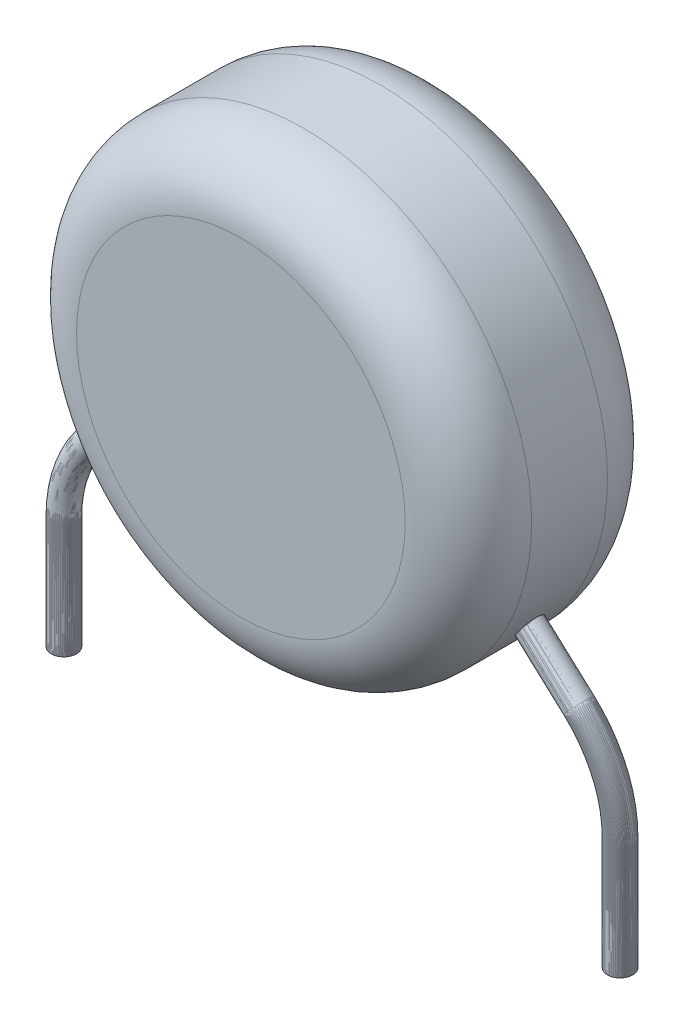
ISO-10303-21;
HEADER;
FILE_DESCRIPTION(('STEP AP214'),'2;1');
FILE_NAME('part.step','',(''),(''),'','','');
FILE_SCHEMA(('AUTOMOTIVE_DESIGN { 1 0 10303 214 1 1 1 1 }'));
ENDSEC;
DATA;
#1=APPLICATION_CONTEXT('core data for automotive mechanical design processes');
#2=APPLICATION_PROTOCOL_DEFINITION('international standard','automotive_design',2000,#1);
#3=PRODUCT_CONTEXT('',#1,'mechanical');
#4=PRODUCT('Part','Part','',(#3));
#5=PRODUCT_RELATED_PRODUCT_CATEGORY('part','',(#4));
#6=PRODUCT_DEFINITION_FORMATION('','',#4);
#7=PRODUCT_DEFINITION_CONTEXT('part definition',#1,'design');
#8=PRODUCT_DEFINITION('design','',#6,#7);
#9=PRODUCT_DEFINITION_SHAPE('','',#8);
#10=(LENGTH_UNIT() NAMED_UNIT(*) SI_UNIT(.MILLI.,.METRE.));
#11=(NAMED_UNIT(*) PLANE_ANGLE_UNIT() SI_UNIT($,.RADIAN.));
#12=(NAMED_UNIT(*) SI_UNIT($,.STERADIAN.) SOLID_ANGLE_UNIT());
#13=UNCERTAINTY_MEASURE_WITH_UNIT(LENGTH_MEASURE(1.E-05),#10,'distance_accuracy_value','');
#14=(GEOMETRIC_REPRESENTATION_CONTEXT(3) GLOBAL_UNCERTAINTY_ASSIGNED_CONTEXT((#13)) GLOBAL_UNIT_ASSIGNED_CONTEXT((#10,
#11,#12)) REPRESENTATION_CONTEXT('',''));
#15=CARTESIAN_POINT('',(0.,0.,0.));
#16=DIRECTION('',(0.,0.,1.));
#17=DIRECTION('',(1.,0.,0.));
#18=AXIS2_PLACEMENT_3D('',#15,#16,#17);
#19=CARTESIAN_POINT('',(11.,0.,0.));
#20=DIRECTION('',(0.,1.,0.));
#21=DIRECTION('',(0.,0.,1.));
#22=AXIS2_PLACEMENT_3D('',#19,#20,#21);
#23=CYLINDRICAL_SURFACE('',#22,0.500000000000001);
#24=CARTESIAN_POINT('',(11.,0.,0.));
#25=DIRECTION('',(0.,1.,0.));
#26=DIRECTION('',(0.,0.,1.));
#27=AXIS2_PLACEMENT_3D('',#24,#25,#26);
#28=CIRCLE('',#27,0.500000000000001);
#29=CARTESIAN_POINT('',(11.,0.,0.500000000000001));
#30=VERTEX_POINT('',#29);
#31=EDGE_CURVE('E49',#30,#30,#28,.T.);
#32=ORIENTED_EDGE('',*,*,#31,.T.);
#33=EDGE_LOOP('',(#32));
#34=FACE_BOUND('',#33,.T.);
#35=CARTESIAN_POINT('',(11.,4.48362223327962,0.));
#36=DIRECTION('',(0.,1.,0.));
#37=DIRECTION('',(0.,0.,1.));
#38=AXIS2_PLACEMENT_3D('',#35,#36,#37);
#39=CIRCLE('',#38,0.500000000000001);
#40=CARTESIAN_POINT('',(11.5,4.48362223327962,0.));
#41=VERTEX_POINT('',#40);
#42=EDGE_CURVE('E11',#41,#41,#39,.T.);
#43=ORIENTED_EDGE('',*,*,#42,.F.);
#44=EDGE_LOOP('',(#43));
#45=FACE_BOUND('',#44,.T.);
#46=ADVANCED_FACE('F42',(#34,#45),#23,.T.);
#47=CARTESIAN_POINT('',(6.,4.48362223327964,0.));
#48=DIRECTION('',(0.,0.,1.));
#49=DIRECTION('',(1.,0.,0.));
#50=AXIS2_PLACEMENT_3D('',#47,#48,#49);
#51=TOROIDAL_SURFACE('',#50,5.,0.500000000000001);
#52=CARTESIAN_POINT('',(9.36771550722865,8.1793619782254,0.));
#53=DIRECTION('',(-0.739147948989153,0.673543101445727,0.));
#54=DIRECTION('',(0.,0.,1.));
#55=AXIS2_PLACEMENT_3D('',#52,#53,#54);
#56=CIRCLE('',#55,0.500000000000001);
#57=CARTESIAN_POINT('',(9.70448705795151,8.54893595271997,0.));
#58=VERTEX_POINT('',#57);
#59=EDGE_CURVE('E55',#58,#58,#56,.T.);
#60=CARTESIAN_POINT('',(6.,4.48362223327964,0.));
#61=DIRECTION('',(0.,0.,1.));
#62=DIRECTION('',(1.,0.,0.));
#63=AXIS2_PLACEMENT_3D('',#60,#61,#62);
#64=CIRCLE('',#63,5.5);
#65=EDGE_CURVE('',#41,#58,#64,.T.);
#66=ORIENTED_EDGE('',*,*,#42,.T.);
#67=ORIENTED_EDGE('',*,*,#59,.F.);
#68=ORIENTED_EDGE('',*,*,#65,.T.);
#69=ORIENTED_EDGE('',*,*,#65,.F.);
#70=EDGE_LOOP('',(#66,#68,#67,#69));
#71=FACE_BOUND('',#70,.T.);
#72=ADVANCED_FACE('F111',(#71),#51,.T.);
#73=CARTESIAN_POINT('',(9.36771550722865,8.1793619782254,0.));
#74=DIRECTION('',(-0.739147948989148,0.673543101445732,0.));
#75=DIRECTION('',(-0.673543101445732,-0.739147948989148,0.));
#76=AXIS2_PLACEMENT_3D('',#73,#74,#75);
#77=CYLINDRICAL_SURFACE('',#76,0.500000000000001);
#78=ORIENTED_EDGE('',*,*,#59,.T.);
#79=EDGE_LOOP('',(#78));
#80=FACE_BOUND('',#79,.T.);
#81=CARTESIAN_POINT('',(3.49835212954528,13.5277759436883,0.));
#82=DIRECTION('',(-0.739147948989153,0.673543101445727,0.));
#83=DIRECTION('',(0.,0.,1.));
#84=AXIS2_PLACEMENT_3D('',#81,#82,#83);
#85=CIRCLE('',#84,0.500000000000001);
#86=CARTESIAN_POINT('',(3.83512368026815,13.8973499181829,0.));
#87=VERTEX_POINT('',#86);
#88=EDGE_CURVE('E60',#87,#87,#85,.T.);
#89=ORIENTED_EDGE('',*,*,#88,.F.);
#90=EDGE_LOOP('',(#89));
#91=FACE_BOUND('',#90,.T.);
#92=ADVANCED_FACE('F105',(#80,#91),#77,.T.);
#93=CARTESIAN_POINT('',(0.13063662231661,9.83203619874261,0.));
#94=DIRECTION('',(0.,0.,1.));
#95=DIRECTION('',(1.,0.,0.));
#96=AXIS2_PLACEMENT_3D('',#93,#94,#95);
#97=TOROIDAL_SURFACE('',#96,5.,0.500000000000001);
#98=CARTESIAN_POINT('',(0.130636622316587,14.8320361987426,0.));
#99=DIRECTION('',(-1.,0.,0.));
#100=DIRECTION('',(0.,0.,1.));
#101=AXIS2_PLACEMENT_3D('',#98,#99,#100);
#102=CIRCLE('',#101,0.500000000000001);
#103=CARTESIAN_POINT('',(0.130636622316585,15.3320361987426,0.));
#104=VERTEX_POINT('',#103);
#105=EDGE_CURVE('E63',#104,#104,#102,.T.);
#106=CARTESIAN_POINT('',(0.13063662231661,9.83203619874261,0.));
#107=DIRECTION('',(0.,0.,1.));
#108=DIRECTION('',(1.,0.,0.));
#109=AXIS2_PLACEMENT_3D('',#106,#107,#108);
#110=CIRCLE('',#109,5.5);
#111=EDGE_CURVE('',#87,#104,#110,.T.);
#112=ORIENTED_EDGE('',*,*,#88,.T.);
#113=ORIENTED_EDGE('',*,*,#105,.F.);
#114=ORIENTED_EDGE('',*,*,#111,.T.);
#115=ORIENTED_EDGE('',*,*,#111,.F.);
#116=EDGE_LOOP('',(#112,#114,#113,#115));
#117=FACE_BOUND('',#116,.T.);
#118=ADVANCED_FACE('F100',(#117),#97,.T.);
#119=CARTESIAN_POINT('',(0.130636622316587,14.8320361987426,0.));
#120=DIRECTION('',(-1.,0.,0.));
#121=DIRECTION('',(0.,0.,1.));
#122=AXIS2_PLACEMENT_3D('',#119,#120,#121);
#123=CYLINDRICAL_SURFACE('',#122,0.500000000000001);
#124=ORIENTED_EDGE('',*,*,#105,.T.);
#125=EDGE_LOOP('',(#124));
#126=FACE_BOUND('',#125,.T.);
#127=CARTESIAN_POINT('',(-0.130636622316592,14.8320361987426,0.));
#128=DIRECTION('',(-1.,0.,0.));
#129=DIRECTION('',(0.,0.,1.));
#130=AXIS2_PLACEMENT_3D('',#127,#128,#129);
#131=CIRCLE('',#130,0.500000000000001);
#132=CARTESIAN_POINT('',(-0.130636622316591,15.3320361987426,0.));
#133=VERTEX_POINT('',#132);
#134=EDGE_CURVE('E66',#133,#133,#131,.T.);
#135=ORIENTED_EDGE('',*,*,#134,.F.);
#136=EDGE_LOOP('',(#135));
#137=FACE_BOUND('',#136,.T.);
#138=ADVANCED_FACE('F94',(#126,#137),#123,.T.);
#139=CARTESIAN_POINT('',(-0.130636622316609,9.83203619874261,0.));
#140=DIRECTION('',(0.,0.,1.));
#141=DIRECTION('',(1.,0.,0.));
#142=AXIS2_PLACEMENT_3D('',#139,#140,#141);
#143=TOROIDAL_SURFACE('',#142,5.,0.500000000000001);
#144=CARTESIAN_POINT('',(-3.49835212954529,13.5277759436883,0.));
#145=DIRECTION('',(-0.739147948989132,-0.67354310144575,0.));
#146=DIRECTION('',(0.,0.,1.));
#147=AXIS2_PLACEMENT_3D('',#144,#145,#146);
#148=CIRCLE('',#147,0.500000000000001);
#149=CARTESIAN_POINT('',(-3.83512368026816,13.8973499181829,0.));
#150=VERTEX_POINT('',#149);
#151=EDGE_CURVE('E69',#150,#150,#148,.T.);
#152=CARTESIAN_POINT('',(-0.130636622316609,9.83203619874261,0.));
#153=DIRECTION('',(0.,0.,1.));
#154=DIRECTION('',(1.,0.,0.));
#155=AXIS2_PLACEMENT_3D('',#152,#153,#154);
#156=CIRCLE('',#155,5.5);
#157=EDGE_CURVE('',#133,#150,#156,.T.);
#158=ORIENTED_EDGE('',*,*,#134,.T.);
#159=ORIENTED_EDGE('',*,*,#151,.F.);
#160=ORIENTED_EDGE('',*,*,#157,.T.);
#161=ORIENTED_EDGE('',*,*,#157,.F.);
#162=EDGE_LOOP('',(#158,#160,#159,#161));
#163=FACE_BOUND('',#162,.T.);
#164=ADVANCED_FACE('F90',(#163),#143,.T.);
#165=CARTESIAN_POINT('',(-3.49835212954529,13.5277759436883,0.));
#166=DIRECTION('',(-0.739147948989148,-0.673543101445732,0.));
#167=DIRECTION('',(0.673543101445732,-0.739147948989148,0.));
#168=AXIS2_PLACEMENT_3D('',#165,#166,#167);
#169=CYLINDRICAL_SURFACE('',#168,0.500000000000001);
#170=ORIENTED_EDGE('',*,*,#151,.T.);
#171=EDGE_LOOP('',(#170));
#172=FACE_BOUND('',#171,.T.);
#173=CARTESIAN_POINT('',(-9.36771550722865,8.17936197822539,0.));
#174=DIRECTION('',(-0.739147948989132,-0.67354310144575,0.));
#175=DIRECTION('',(0.,0.,1.));
#176=AXIS2_PLACEMENT_3D('',#173,#174,#175);
#177=CIRCLE('',#176,0.500000000000001);
#178=CARTESIAN_POINT('',(-9.70448705795151,8.54893595271997,0.));
#179=VERTEX_POINT('',#178);
#180=EDGE_CURVE('E72',#179,#179,#177,.T.);
#181=ORIENTED_EDGE('',*,*,#180,.F.);
#182=EDGE_LOOP('',(#181));
#183=FACE_BOUND('',#182,.T.);
#184=ADVANCED_FACE('F85',(#172,#183),#169,.T.);
#185=CARTESIAN_POINT('',(-6.,4.48362223327964,0.));
#186=DIRECTION('',(0.,0.,1.));
#187=DIRECTION('',(1.,0.,0.));
#188=AXIS2_PLACEMENT_3D('',#185,#186,#187);
#189=TOROIDAL_SURFACE('',#188,5.,0.500000000000001);
#190=CARTESIAN_POINT('',(-11.,4.48362223327962,0.));
#191=DIRECTION('',(0.,-1.,0.));
#192=DIRECTION('',(0.,0.,1.));
#193=AXIS2_PLACEMENT_3D('',#190,#191,#192);
#194=CIRCLE('',#193,0.500000000000001);
#195=CARTESIAN_POINT('',(-11.5,4.48362223327961,0.));
#196=VERTEX_POINT('',#195);
#197=EDGE_CURVE('E74',#196,#196,#194,.T.);
#198=CARTESIAN_POINT('',(-6.,4.48362223327964,0.));
#199=DIRECTION('',(0.,0.,1.));
#200=DIRECTION('',(1.,0.,0.));
#201=AXIS2_PLACEMENT_3D('',#198,#199,#200);
#202=CIRCLE('',#201,5.5);
#203=EDGE_CURVE('',#179,#196,#202,.T.);
#204=ORIENTED_EDGE('',*,*,#180,.T.);
#205=ORIENTED_EDGE('',*,*,#197,.F.);
#206=ORIENTED_EDGE('',*,*,#203,.T.);
#207=ORIENTED_EDGE('',*,*,#203,.F.);
#208=EDGE_LOOP('',(#204,#206,#205,#207));
#209=FACE_BOUND('',#208,.T.);
#210=ADVANCED_FACE('F43',(#209),#189,.T.);
#211=CARTESIAN_POINT('',(-11.,4.48362223327962,0.));
#212=DIRECTION('',(0.,-1.,0.));
#213=DIRECTION('',(0.,0.,-1.));
#214=AXIS2_PLACEMENT_3D('',#211,#212,#213);
#215=CYLINDRICAL_SURFACE('',#214,0.500000000000001);
#216=ORIENTED_EDGE('',*,*,#197,.T.);
#217=EDGE_LOOP('',(#216));
#218=FACE_BOUND('',#217,.T.);
#219=CARTESIAN_POINT('',(-11.,0.,0.));
#220=DIRECTION('',(0.,-1.,0.));
#221=DIRECTION('',(0.,0.,1.));
#222=AXIS2_PLACEMENT_3D('',#219,#220,#221);
#223=CIRCLE('',#222,0.500000000000001);
#224=CARTESIAN_POINT('',(-11.,0.,0.500000000000001));
#225=VERTEX_POINT('',#224);
#226=EDGE_CURVE('E46',#225,#225,#223,.T.);
#227=ORIENTED_EDGE('',*,*,#226,.F.);
#228=EDGE_LOOP('',(#227));
#229=FACE_BOUND('',#228,.T.);
#230=ADVANCED_FACE('F44',(#218,#229),#215,.T.);
#231=OPEN_SHELL('',(#46,#72,#92,#118,#138,#164,#184,#210,#230));
#232=SHELL_BASED_SURFACE_MODEL('B2',(#231));
#233=CARTESIAN_POINT('',(-11.,0.,0.));
#234=DIRECTION('',(0.,1.,0.));
#235=DIRECTION('',(0.,0.,1.));
#236=AXIS2_PLACEMENT_3D('',#233,#234,#235);
#237=CYLINDRICAL_SURFACE('',#236,0.500000000000001);
#238=CARTESIAN_POINT('',(-11.,0.,0.));
#239=DIRECTION('',(0.,1.,0.));
#240=DIRECTION('',(0.,0.,1.));
#241=AXIS2_PLACEMENT_3D('',#238,#239,#240);
#242=CIRCLE('',#241,0.500000000000001);
#243=CARTESIAN_POINT('',(-11.,0.,0.500000000000001));
#244=VERTEX_POINT('',#243);
#245=EDGE_CURVE('E202',#244,#244,#242,.T.);
#246=ORIENTED_EDGE('',*,*,#245,.T.);
#247=EDGE_LOOP('',(#246));
#248=FACE_BOUND('',#247,.T.);
#249=CARTESIAN_POINT('',(-11.,4.48362223327962,0.));
#250=DIRECTION('',(0.,1.,0.));
#251=DIRECTION('',(0.,0.,1.));
#252=AXIS2_PLACEMENT_3D('',#249,#250,#251);
#253=CIRCLE('',#252,0.500000000000001);
#254=CARTESIAN_POINT('',(-11.5,4.48362223327962,0.));
#255=VERTEX_POINT('',#254);
#256=EDGE_CURVE('E41',#255,#255,#253,.T.);
#257=ORIENTED_EDGE('',*,*,#256,.F.);
#258=EDGE_LOOP('',(#257));
#259=FACE_BOUND('',#258,.T.);
#260=ADVANCED_FACE('F195',(#248,#259),#237,.T.);
#261=CARTESIAN_POINT('',(-6.,4.48362223327964,0.));
#262=DIRECTION('',(0.,0.,-1.));
#263=DIRECTION('',(-1.,0.,0.));
#264=AXIS2_PLACEMENT_3D('',#261,#262,#263);
#265=TOROIDAL_SURFACE('',#264,5.,0.500000000000001);
#266=CARTESIAN_POINT('',(-9.36771550722864,8.1793619782254,0.));
#267=DIRECTION('',(0.739147948989154,0.673543101445726,0.));
#268=DIRECTION('',(0.,0.,1.));
#269=AXIS2_PLACEMENT_3D('',#266,#267,#268);
#270=CIRCLE('',#269,0.500000000000001);
#271=CARTESIAN_POINT('',(-9.70448705795151,8.54893595271997,0.));
#272=VERTEX_POINT('',#271);
#273=EDGE_CURVE('E208',#272,#272,#270,.T.);
#274=CARTESIAN_POINT('',(-6.,4.48362223327964,0.));
#275=DIRECTION('',(0.,0.,-1.));
#276=DIRECTION('',(-1.,0.,0.));
#277=AXIS2_PLACEMENT_3D('',#274,#275,#276);
#278=CIRCLE('',#277,5.5);
#279=EDGE_CURVE('',#255,#272,#278,.T.);
#280=ORIENTED_EDGE('',*,*,#256,.T.);
#281=ORIENTED_EDGE('',*,*,#273,.F.);
#282=ORIENTED_EDGE('',*,*,#279,.T.);
#283=ORIENTED_EDGE('',*,*,#279,.F.);
#284=EDGE_LOOP('',(#280,#282,#281,#283));
#285=FACE_BOUND('',#284,.T.);
#286=ADVANCED_FACE('F264',(#285),#265,.T.);
#287=CARTESIAN_POINT('',(-9.36771550722864,8.1793619782254,0.));
#288=DIRECTION('',(0.739147948989148,0.673543101445732,0.));
#289=DIRECTION('',(-0.673543101445732,0.739147948989148,0.));
#290=AXIS2_PLACEMENT_3D('',#287,#288,#289);
#291=CYLINDRICAL_SURFACE('',#290,0.500000000000001);
#292=ORIENTED_EDGE('',*,*,#273,.T.);
#293=EDGE_LOOP('',(#292));
#294=FACE_BOUND('',#293,.T.);
#295=CARTESIAN_POINT('',(-3.49835212954528,13.5277759436883,0.));
#296=DIRECTION('',(0.739147948989154,0.673543101445726,0.));
#297=DIRECTION('',(0.,0.,1.));
#298=AXIS2_PLACEMENT_3D('',#295,#296,#297);
#299=CIRCLE('',#298,0.500000000000001);
#300=CARTESIAN_POINT('',(-3.83512368026815,13.8973499181829,0.));
#301=VERTEX_POINT('',#300);
#302=EDGE_CURVE('E213',#301,#301,#299,.T.);
#303=ORIENTED_EDGE('',*,*,#302,.F.);
#304=EDGE_LOOP('',(#303));
#305=FACE_BOUND('',#304,.T.);
#306=ADVANCED_FACE('F258',(#294,#305),#291,.T.);
#307=CARTESIAN_POINT('',(-0.13063662231661,9.83203619874261,0.));
#308=DIRECTION('',(0.,0.,-1.));
#309=DIRECTION('',(-1.,0.,0.));
#310=AXIS2_PLACEMENT_3D('',#307,#308,#309);
#311=TOROIDAL_SURFACE('',#310,5.,0.500000000000001);
#312=CARTESIAN_POINT('',(-0.130636622316587,14.8320361987426,0.));
#313=DIRECTION('',(1.,0.,0.));
#314=DIRECTION('',(0.,0.,1.));
#315=AXIS2_PLACEMENT_3D('',#312,#313,#314);
#316=CIRCLE('',#315,0.500000000000001);
#317=CARTESIAN_POINT('',(-0.130636622316585,15.3320361987426,0.));
#318=VERTEX_POINT('',#317);
#319=EDGE_CURVE('E216',#318,#318,#316,.T.);
#320=CARTESIAN_POINT('',(-0.13063662231661,9.83203619874261,0.));
#321=DIRECTION('',(0.,0.,-1.));
#322=DIRECTION('',(-1.,0.,0.));
#323=AXIS2_PLACEMENT_3D('',#320,#321,#322);
#324=CIRCLE('',#323,5.5);
#325=EDGE_CURVE('',#301,#318,#324,.T.);
#326=ORIENTED_EDGE('',*,*,#302,.T.);
#327=ORIENTED_EDGE('',*,*,#319,.F.);
#328=ORIENTED_EDGE('',*,*,#325,.T.);
#329=ORIENTED_EDGE('',*,*,#325,.F.);
#330=EDGE_LOOP('',(#326,#328,#327,#329));
#331=FACE_BOUND('',#330,.T.);
#332=ADVANCED_FACE('F253',(#331),#311,.T.);
#333=CARTESIAN_POINT('',(-0.130636622316587,14.8320361987426,0.));
#334=DIRECTION('',(1.,0.,0.));
#335=DIRECTION('',(0.,0.,-1.));
#336=AXIS2_PLACEMENT_3D('',#333,#334,#335);
#337=CYLINDRICAL_SURFACE('',#336,0.500000000000001);
#338=ORIENTED_EDGE('',*,*,#319,.T.);
#339=EDGE_LOOP('',(#338));
#340=FACE_BOUND('',#339,.T.);
#341=CARTESIAN_POINT('',(0.130636622316592,14.8320361987426,0.));
#342=DIRECTION('',(1.,0.,0.));
#343=DIRECTION('',(0.,0.,1.));
#344=AXIS2_PLACEMENT_3D('',#341,#342,#343);
#345=CIRCLE('',#344,0.500000000000001);
#346=CARTESIAN_POINT('',(0.130636622316591,15.3320361987426,0.));
#347=VERTEX_POINT('',#346);
#348=EDGE_CURVE('E219',#347,#347,#345,.T.);
#349=ORIENTED_EDGE('',*,*,#348,.F.);
#350=EDGE_LOOP('',(#349));
#351=FACE_BOUND('',#350,.T.);
#352=ADVANCED_FACE('F247',(#340,#351),#337,.T.);
#353=CARTESIAN_POINT('',(0.13063662231661,9.83203619874261,0.));
#354=DIRECTION('',(0.,0.,-1.));
#355=DIRECTION('',(-1.,0.,0.));
#356=AXIS2_PLACEMENT_3D('',#353,#354,#355);
#357=TOROIDAL_SURFACE('',#356,5.,0.500000000000001);
#358=CARTESIAN_POINT('',(3.49835212954529,13.5277759436883,0.));
#359=DIRECTION('',(0.739147948989131,-0.673543101445751,0.));
#360=DIRECTION('',(0.,0.,1.));
#361=AXIS2_PLACEMENT_3D('',#358,#359,#360);
#362=CIRCLE('',#361,0.500000000000001);
#363=CARTESIAN_POINT('',(3.83512368026816,13.8973499181829,0.));
#364=VERTEX_POINT('',#363);
#365=EDGE_CURVE('E222',#364,#364,#362,.T.);
#366=CARTESIAN_POINT('',(0.13063662231661,9.83203619874261,0.));
#367=DIRECTION('',(0.,0.,-1.));
#368=DIRECTION('',(-1.,0.,0.));
#369=AXIS2_PLACEMENT_3D('',#366,#367,#368);
#370=CIRCLE('',#369,5.5);
#371=EDGE_CURVE('',#347,#364,#370,.T.);
#372=ORIENTED_EDGE('',*,*,#348,.T.);
#373=ORIENTED_EDGE('',*,*,#365,.F.);
#374=ORIENTED_EDGE('',*,*,#371,.T.);
#375=ORIENTED_EDGE('',*,*,#371,.F.);
#376=EDGE_LOOP('',(#372,#374,#373,#375));
#377=FACE_BOUND('',#376,.T.);
#378=ADVANCED_FACE('F243',(#377),#357,.T.);
#379=CARTESIAN_POINT('',(3.49835212954529,13.5277759436883,0.));
#380=DIRECTION('',(0.739147948989148,-0.673543101445732,0.));
#381=DIRECTION('',(0.673543101445732,0.739147948989148,0.));
#382=AXIS2_PLACEMENT_3D('',#379,#380,#381);
#383=CYLINDRICAL_SURFACE('',#382,0.500000000000001);
#384=ORIENTED_EDGE('',*,*,#365,.T.);
#385=EDGE_LOOP('',(#384));
#386=FACE_BOUND('',#385,.T.);
#387=CARTESIAN_POINT('',(9.36771550722865,8.17936197822539,0.));
#388=DIRECTION('',(0.739147948989131,-0.673543101445751,0.));
#389=DIRECTION('',(0.,0.,1.));
#390=AXIS2_PLACEMENT_3D('',#387,#388,#389);
#391=CIRCLE('',#390,0.500000000000001);
#392=CARTESIAN_POINT('',(9.70448705795151,8.54893595271997,0.));
#393=VERTEX_POINT('',#392);
#394=EDGE_CURVE('E225',#393,#393,#391,.T.);
#395=ORIENTED_EDGE('',*,*,#394,.F.);
#396=EDGE_LOOP('',(#395));
#397=FACE_BOUND('',#396,.T.);
#398=ADVANCED_FACE('F238',(#386,#397),#383,.T.);
#399=CARTESIAN_POINT('',(6.,4.48362223327964,0.));
#400=DIRECTION('',(0.,0.,-1.));
#401=DIRECTION('',(-1.,0.,0.));
#402=AXIS2_PLACEMENT_3D('',#399,#400,#401);
#403=TOROIDAL_SURFACE('',#402,5.,0.500000000000001);
#404=CARTESIAN_POINT('',(11.,4.48362223327962,0.));
#405=DIRECTION('',(0.,-1.,0.));
#406=DIRECTION('',(0.,0.,1.));
#407=AXIS2_PLACEMENT_3D('',#404,#405,#406);
#408=CIRCLE('',#407,0.500000000000001);
#409=CARTESIAN_POINT('',(11.5,4.48362223327962,0.));
#410=VERTEX_POINT('',#409);
#411=EDGE_CURVE('E227',#410,#410,#408,.T.);
#412=CARTESIAN_POINT('',(6.,4.48362223327964,0.));
#413=DIRECTION('',(0.,0.,-1.));
#414=DIRECTION('',(-1.,0.,0.));
#415=AXIS2_PLACEMENT_3D('',#412,#413,#414);
#416=CIRCLE('',#415,5.5);
#417=EDGE_CURVE('',#393,#410,#416,.T.);
#418=ORIENTED_EDGE('',*,*,#394,.T.);
#419=ORIENTED_EDGE('',*,*,#411,.F.);
#420=ORIENTED_EDGE('',*,*,#417,.T.);
#421=ORIENTED_EDGE('',*,*,#417,.F.);
#422=EDGE_LOOP('',(#418,#420,#419,#421));
#423=FACE_BOUND('',#422,.T.);
#424=ADVANCED_FACE('F196',(#423),#403,.T.);
#425=CARTESIAN_POINT('',(11.,4.48362223327962,0.));
#426=DIRECTION('',(0.,-1.,0.));
#427=DIRECTION('',(0.,0.,-1.));
#428=AXIS2_PLACEMENT_3D('',#425,#426,#427);
#429=CYLINDRICAL_SURFACE('',#428,0.500000000000001);
#430=ORIENTED_EDGE('',*,*,#411,.T.);
#431=EDGE_LOOP('',(#430));
#432=FACE_BOUND('',#431,.T.);
#433=CARTESIAN_POINT('',(11.,0.,0.));
#434=DIRECTION('',(0.,-1.,0.));
#435=DIRECTION('',(0.,0.,1.));
#436=AXIS2_PLACEMENT_3D('',#433,#434,#435);
#437=CIRCLE('',#436,0.500000000000001);
#438=CARTESIAN_POINT('',(11.,0.,0.500000000000001));
#439=VERTEX_POINT('',#438);
#440=EDGE_CURVE('E199',#439,#439,#437,.T.);
#441=ORIENTED_EDGE('',*,*,#440,.F.);
#442=EDGE_LOOP('',(#441));
#443=FACE_BOUND('',#442,.T.);
#444=ADVANCED_FACE('F197',(#432,#443),#429,.T.);
#445=OPEN_SHELL('',(#260,#286,#306,#332,#352,#378,#398,#424,#444));
#446=SHELL_BASED_SURFACE_MODEL('B6',(#445));
#447=CARTESIAN_POINT('',(11.,4.48,0.));
#448=DIRECTION('',(0.,-1.,0.));
#449=DIRECTION('',(0.,0.,-1.));
#450=AXIS2_PLACEMENT_3D('',#447,#448,#449);
#451=CYLINDRICAL_SURFACE('',#450,0.500000000000001);
#452=CARTESIAN_POINT('',(11.,4.48,0.));
#453=DIRECTION('',(0.,1.,0.));
#454=DIRECTION('',(0.,0.,1.));
#455=AXIS2_PLACEMENT_3D('',#452,#453,#454);
#456=CIRCLE('',#455,0.500000000000001);
#457=CARTESIAN_POINT('',(11.,4.48,0.500000000000001));
#458=VERTEX_POINT('',#457);
#459=EDGE_CURVE('E194',#458,#458,#456,.T.);
#460=ORIENTED_EDGE('',*,*,#459,.F.);
#461=EDGE_LOOP('',(#460));
#462=FACE_BOUND('',#461,.T.);
#463=CARTESIAN_POINT('',(11.,0.,0.));
#464=DIRECTION('',(0.,1.,0.));
#465=DIRECTION('',(0.,0.,1.));
#466=AXIS2_PLACEMENT_3D('',#463,#464,#465);
#467=CIRCLE('',#466,0.500000000000001);
#468=CARTESIAN_POINT('',(11.,0.,0.500000000000001));
#469=VERTEX_POINT('',#468);
#470=EDGE_CURVE('E351',#469,#469,#467,.T.);
#471=ORIENTED_EDGE('',*,*,#470,.T.);
#472=EDGE_LOOP('',(#471));
#473=FACE_BOUND('',#472,.T.);
#474=ADVANCED_FACE('F348',(#462,#473),#451,.T.);
#475=CARTESIAN_POINT('',(11.,4.48,0.));
#476=DIRECTION('',(0.,1.,0.));
#477=DIRECTION('',(0.,0.,1.));
#478=AXIS2_PLACEMENT_3D('',#475,#476,#477);
#479=PLANE('',#478);
#480=ORIENTED_EDGE('',*,*,#459,.T.);
#481=EDGE_LOOP('',(#480));
#482=FACE_BOUND('',#481,.T.);
#483=ADVANCED_FACE('F363',(#482),#479,.T.);
#484=CARTESIAN_POINT('',(11.,0.,0.));
#485=DIRECTION('',(0.,1.,0.));
#486=DIRECTION('',(0.,0.,1.));
#487=AXIS2_PLACEMENT_3D('',#484,#485,#486);
#488=PLANE('',#487);
#489=ORIENTED_EDGE('',*,*,#470,.F.);
#490=EDGE_LOOP('',(#489));
#491=FACE_BOUND('',#490,.T.);
#492=ADVANCED_FACE('F361',(#491),#488,.F.);
#493=CLOSED_SHELL('',(#474,#483,#492));
#494=MANIFOLD_SOLID_BREP('B36',#493);
#495=CARTESIAN_POINT('',(-11.,4.48,0.));
#496=DIRECTION('',(0.,-1.,0.));
#497=DIRECTION('',(0.,0.,-1.));
#498=AXIS2_PLACEMENT_3D('',#495,#496,#497);
#499=CYLINDRICAL_SURFACE('',#498,0.500000000000001);
#500=CARTESIAN_POINT('',(-11.,4.48,0.));
#501=DIRECTION('',(0.,1.,0.));
#502=DIRECTION('',(0.,0.,1.));
#503=AXIS2_PLACEMENT_3D('',#500,#501,#502);
#504=CIRCLE('',#503,0.500000000000001);
#505=CARTESIAN_POINT('',(-11.,4.48,0.500000000000001));
#506=VERTEX_POINT('',#505);
#507=EDGE_CURVE('E347',#506,#506,#504,.T.);
#508=ORIENTED_EDGE('',*,*,#507,.F.);
#509=EDGE_LOOP('',(#508));
#510=FACE_BOUND('',#509,.T.);
#511=CARTESIAN_POINT('',(-11.,0.,0.));
#512=DIRECTION('',(0.,1.,0.));
#513=DIRECTION('',(0.,0.,1.));
#514=AXIS2_PLACEMENT_3D('',#511,#512,#513);
#515=CIRCLE('',#514,0.500000000000001);
#516=CARTESIAN_POINT('',(-11.,0.,0.500000000000001));
#517=VERTEX_POINT('',#516);
#518=EDGE_CURVE('E399',#517,#517,#515,.T.);
#519=ORIENTED_EDGE('',*,*,#518,.T.);
#520=EDGE_LOOP('',(#519));
#521=FACE_BOUND('',#520,.T.);
#522=ADVANCED_FACE('F396',(#510,#521),#499,.T.);
#523=CARTESIAN_POINT('',(-11.,4.48,0.));
#524=DIRECTION('',(0.,1.,0.));
#525=DIRECTION('',(0.,0.,1.));
#526=AXIS2_PLACEMENT_3D('',#523,#524,#525);
#527=PLANE('',#526);
#528=ORIENTED_EDGE('',*,*,#507,.T.);
#529=EDGE_LOOP('',(#528));
#530=FACE_BOUND('',#529,.T.);
#531=ADVANCED_FACE('F411',(#530),#527,.T.);
#532=CARTESIAN_POINT('',(-11.,0.,0.));
#533=DIRECTION('',(0.,1.,0.));
#534=DIRECTION('',(0.,0.,1.));
#535=AXIS2_PLACEMENT_3D('',#532,#533,#534);
#536=PLANE('',#535);
#537=ORIENTED_EDGE('',*,*,#518,.F.);
#538=EDGE_LOOP('',(#537));
#539=FACE_BOUND('',#538,.T.);
#540=ADVANCED_FACE('F409',(#539),#536,.F.);
#541=CLOSED_SHELL('',(#522,#531,#540));
#542=MANIFOLD_SOLID_BREP('B189',#541);
#543=CARTESIAN_POINT('',(0.,15.,-4.));
#544=DIRECTION('',(0.,0.,1.));
#545=DIRECTION('',(1.,0.,0.));
#546=AXIS2_PLACEMENT_3D('',#543,#544,#545);
#547=CYLINDRICAL_SURFACE('',#546,9.);
#548=CARTESIAN_POINT('',(0.,15.,-1.5));
#549=DIRECTION('',(0.,0.,1.));
#550=DIRECTION('',(1.,0.,0.));
#551=AXIS2_PLACEMENT_3D('',#548,#549,#550);
#552=CIRCLE('',#551,9.);
#553=CARTESIAN_POINT('',(9.,15.,-1.5));
#554=VERTEX_POINT('',#553);
#555=EDGE_CURVE('E448',#554,#554,#552,.T.);
#556=ORIENTED_EDGE('',*,*,#555,.T.);
#557=EDGE_LOOP('',(#556));
#558=FACE_BOUND('',#557,.T.);
#559=CARTESIAN_POINT('',(0.,15.,1.5));
#560=DIRECTION('',(0.,0.,1.));
#561=DIRECTION('',(1.,0.,0.));
#562=AXIS2_PLACEMENT_3D('',#559,#560,#561);
#563=CIRCLE('',#562,9.);
#564=CARTESIAN_POINT('',(9.,15.,1.5));
#565=VERTEX_POINT('',#564);
#566=EDGE_CURVE('E452',#565,#565,#563,.F.);
#567=ORIENTED_EDGE('',*,*,#566,.T.);
#568=EDGE_LOOP('',(#567));
#569=FACE_BOUND('',#568,.T.);
#570=ADVANCED_FACE('F437',(#558,#569),#547,.T.);
#571=CARTESIAN_POINT('',(0.,15.,-4.));
#572=DIRECTION('',(0.,0.,1.));
#573=DIRECTION('',(1.,0.,0.));
#574=AXIS2_PLACEMENT_3D('',#571,#572,#573);
#575=PLANE('',#574);
#576=CARTESIAN_POINT('',(0.,15.,-4.));
#577=DIRECTION('',(0.,0.,1.));
#578=DIRECTION('',(1.,0.,0.));
#579=AXIS2_PLACEMENT_3D('',#576,#577,#578);
#580=CIRCLE('',#579,6.5);
#581=CARTESIAN_POINT('',(6.5,15.,-4.));
#582=VERTEX_POINT('',#581);
#583=EDGE_CURVE('E444',#582,#582,#580,.F.);
#584=ORIENTED_EDGE('',*,*,#583,.T.);
#585=EDGE_LOOP('',(#584));
#586=FACE_BOUND('',#585,.T.);
#587=ADVANCED_FACE('F468',(#586),#575,.F.);
#588=CARTESIAN_POINT('',(0.,15.,4.));
#589=DIRECTION('',(0.,0.,1.));
#590=DIRECTION('',(1.,0.,0.));
#591=AXIS2_PLACEMENT_3D('',#588,#589,#590);
#592=PLANE('',#591);
#593=CARTESIAN_POINT('',(0.,15.,4.));
#594=DIRECTION('',(0.,0.,1.));
#595=DIRECTION('',(1.,0.,0.));
#596=AXIS2_PLACEMENT_3D('',#593,#594,#595);
#597=CIRCLE('',#596,6.5);
#598=CARTESIAN_POINT('',(6.5,15.,4.));
#599=VERTEX_POINT('',#598);
#600=EDGE_CURVE('E395',#599,#599,#597,.T.);
#601=ORIENTED_EDGE('',*,*,#600,.T.);
#602=EDGE_LOOP('',(#601));
#603=FACE_BOUND('',#602,.T.);
#604=ADVANCED_FACE('F465',(#603),#592,.T.);
#605=CARTESIAN_POINT('',(0.,15.,-1.5));
#606=DIRECTION('',(0.,0.,1.));
#607=DIRECTION('',(1.,0.,0.));
#608=AXIS2_PLACEMENT_3D('',#605,#606,#607);
#609=TOROIDAL_SURFACE('',#608,6.5,2.5);
#610=ORIENTED_EDGE('',*,*,#583,.F.);
#611=EDGE_LOOP('',(#610));
#612=FACE_BOUND('',#611,.T.);
#613=ORIENTED_EDGE('',*,*,#555,.F.);
#614=EDGE_LOOP('',(#613));
#615=FACE_BOUND('',#614,.T.);
#616=ADVANCED_FACE('F461',(#612,#615),#609,.T.);
#617=CARTESIAN_POINT('',(0.,15.,1.5));
#618=DIRECTION('',(0.,0.,1.));
#619=DIRECTION('',(1.,0.,0.));
#620=AXIS2_PLACEMENT_3D('',#617,#618,#619);
#621=TOROIDAL_SURFACE('',#620,6.5,2.5);
#622=ORIENTED_EDGE('',*,*,#566,.F.);
#623=EDGE_LOOP('',(#622));
#624=FACE_BOUND('',#623,.T.);
#625=ORIENTED_EDGE('',*,*,#600,.F.);
#626=EDGE_LOOP('',(#625));
#627=FACE_BOUND('',#626,.T.);
#628=ADVANCED_FACE('F439',(#624,#627),#621,.T.);
#629=CLOSED_SHELL('',(#570,#587,#604,#616,#628));
#630=MANIFOLD_SOLID_BREP('B342',#629);
#631=ADVANCED_BREP_SHAPE_REPRESENTATION('',(#18,#494,#542,#630),#14);
#632=MANIFOLD_SURFACE_SHAPE_REPRESENTATION('',(#18,#232,#446),#14);
#633=SHAPE_REPRESENTATION('',(#18),#14);
#634=SHAPE_DEFINITION_REPRESENTATION(#9,#633);
#635=SHAPE_REPRESENTATION_RELATIONSHIP('','',#633,#631);
#636=SHAPE_REPRESENTATION_RELATIONSHIP('','',#633,#632);
ENDSEC;
END-ISO-10303-21;
